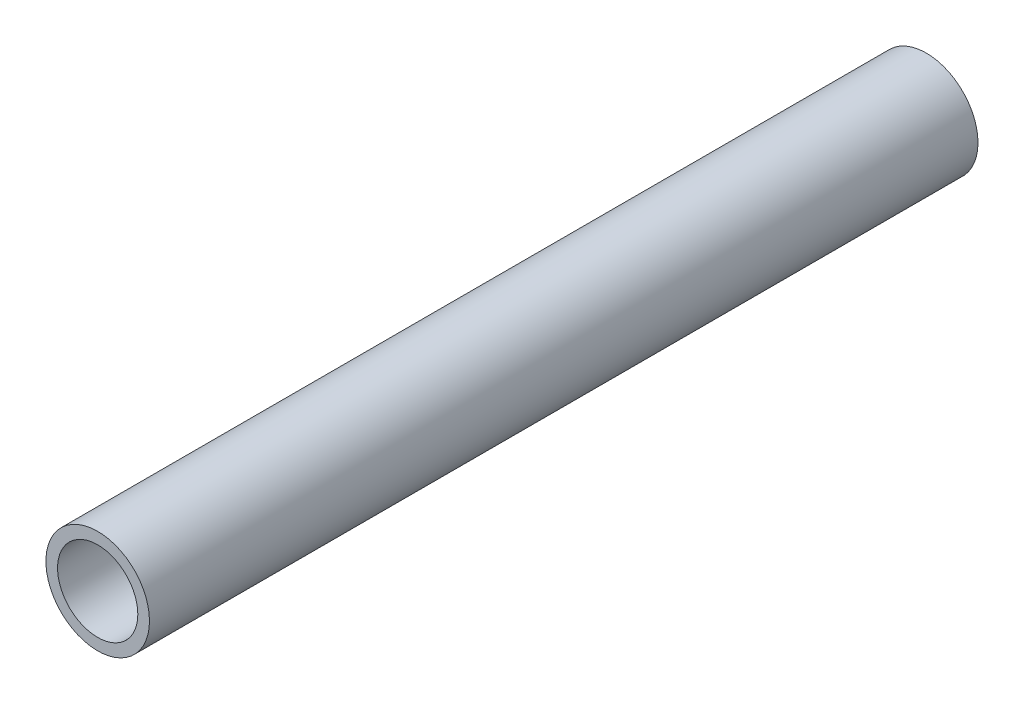
ISO-10303-21;
HEADER;
FILE_DESCRIPTION(('STEP AP214'),'2;1');
FILE_NAME('part.step','',(''),(''),'','','');
FILE_SCHEMA(('AUTOMOTIVE_DESIGN { 1 0 10303 214 1 1 1 1 }'));
ENDSEC;
DATA;
#1=APPLICATION_CONTEXT('core data for automotive mechanical design processes');
#2=APPLICATION_PROTOCOL_DEFINITION('international standard','automotive_design',2000,#1);
#3=PRODUCT_CONTEXT('',#1,'mechanical');
#4=PRODUCT('Part','Part','',(#3));
#5=PRODUCT_RELATED_PRODUCT_CATEGORY('part','',(#4));
#6=PRODUCT_DEFINITION_FORMATION('','',#4);
#7=PRODUCT_DEFINITION_CONTEXT('part definition',#1,'design');
#8=PRODUCT_DEFINITION('design','',#6,#7);
#9=PRODUCT_DEFINITION_SHAPE('','',#8);
#10=(LENGTH_UNIT() NAMED_UNIT(*) SI_UNIT(.MILLI.,.METRE.));
#11=(NAMED_UNIT(*) PLANE_ANGLE_UNIT() SI_UNIT($,.RADIAN.));
#12=(NAMED_UNIT(*) SI_UNIT($,.STERADIAN.) SOLID_ANGLE_UNIT());
#13=UNCERTAINTY_MEASURE_WITH_UNIT(LENGTH_MEASURE(1.E-05),#10,'distance_accuracy_value','');
#14=(GEOMETRIC_REPRESENTATION_CONTEXT(3) GLOBAL_UNCERTAINTY_ASSIGNED_CONTEXT((#13)) GLOBAL_UNIT_ASSIGNED_CONTEXT((#10,
#11,#12)) REPRESENTATION_CONTEXT('',''));
#15=CARTESIAN_POINT('',(0.,0.,0.));
#16=DIRECTION('',(0.,0.,1.));
#17=DIRECTION('',(1.,0.,0.));
#18=AXIS2_PLACEMENT_3D('',#15,#16,#17);
#19=CARTESIAN_POINT('',(0.,0.,16.));
#20=DIRECTION('',(0.,0.,1.));
#21=DIRECTION('',(1.,0.,0.));
#22=AXIS2_PLACEMENT_3D('',#19,#20,#21);
#23=PLANE('',#22);
#24=CARTESIAN_POINT('',(0.,0.,16.));
#25=DIRECTION('',(0.,0.,1.));
#26=DIRECTION('',(1.,0.,0.));
#27=AXIS2_PLACEMENT_3D('',#24,#25,#26);
#28=CIRCLE('',#27,1.);
#29=CARTESIAN_POINT('',(1.,0.,16.));
#30=VERTEX_POINT('',#29);
#31=EDGE_CURVE('E10',#30,#30,#28,.T.);
#32=ORIENTED_EDGE('',*,*,#31,.T.);
#33=EDGE_LOOP('',(#32));
#34=FACE_BOUND('',#33,.T.);
#35=CARTESIAN_POINT('',(0.,0.,16.));
#36=DIRECTION('',(0.,0.,1.));
#37=DIRECTION('',(1.,0.,0.));
#38=AXIS2_PLACEMENT_3D('',#35,#36,#37);
#39=CIRCLE('',#38,0.775);
#40=CARTESIAN_POINT('',(0.775,0.,16.));
#41=VERTEX_POINT('',#40);
#42=EDGE_CURVE('E46',#41,#41,#39,.T.);
#43=ORIENTED_EDGE('',*,*,#42,.F.);
#44=EDGE_LOOP('',(#43));
#45=FACE_BOUND('',#44,.T.);
#46=ADVANCED_FACE('F35',(#34,#45),#23,.T.);
#47=CARTESIAN_POINT('',(0.,0.,0.));
#48=DIRECTION('',(0.,0.,1.));
#49=DIRECTION('',(1.,0.,0.));
#50=AXIS2_PLACEMENT_3D('',#47,#48,#49);
#51=PLANE('',#50);
#52=CARTESIAN_POINT('',(0.,0.,0.));
#53=DIRECTION('',(0.,0.,1.));
#54=DIRECTION('',(1.,0.,0.));
#55=AXIS2_PLACEMENT_3D('',#52,#53,#54);
#56=CIRCLE('',#55,1.);
#57=CARTESIAN_POINT('',(1.,0.,0.));
#58=VERTEX_POINT('',#57);
#59=EDGE_CURVE('E39',#58,#58,#56,.T.);
#60=ORIENTED_EDGE('',*,*,#59,.F.);
#61=EDGE_LOOP('',(#60));
#62=FACE_BOUND('',#61,.T.);
#63=CARTESIAN_POINT('',(0.,0.,0.));
#64=DIRECTION('',(0.,0.,1.));
#65=DIRECTION('',(1.,0.,0.));
#66=AXIS2_PLACEMENT_3D('',#63,#64,#65);
#67=CIRCLE('',#66,0.775);
#68=CARTESIAN_POINT('',(0.775,0.,0.));
#69=VERTEX_POINT('',#68);
#70=EDGE_CURVE('E48',#69,#69,#67,.T.);
#71=ORIENTED_EDGE('',*,*,#70,.T.);
#72=EDGE_LOOP('',(#71));
#73=FACE_BOUND('',#72,.T.);
#74=ADVANCED_FACE('F58',(#62,#73),#51,.F.);
#75=CARTESIAN_POINT('',(0.,0.,16.));
#76=DIRECTION('',(0.,0.,-1.));
#77=DIRECTION('',(-1.,0.,0.));
#78=AXIS2_PLACEMENT_3D('',#75,#76,#77);
#79=CYLINDRICAL_SURFACE('',#78,1.);
#80=ORIENTED_EDGE('',*,*,#31,.F.);
#81=EDGE_LOOP('',(#80));
#82=FACE_BOUND('',#81,.T.);
#83=ORIENTED_EDGE('',*,*,#59,.T.);
#84=EDGE_LOOP('',(#83));
#85=FACE_BOUND('',#84,.T.);
#86=ADVANCED_FACE('F37',(#82,#85),#79,.T.);
#87=CARTESIAN_POINT('',(0.,0.,16.));
#88=DIRECTION('',(0.,0.,-1.));
#89=DIRECTION('',(-1.,0.,0.));
#90=AXIS2_PLACEMENT_3D('',#87,#88,#89);
#91=CYLINDRICAL_SURFACE('',#90,0.775);
#92=ORIENTED_EDGE('',*,*,#42,.T.);
#93=EDGE_LOOP('',(#92));
#94=FACE_BOUND('',#93,.T.);
#95=ORIENTED_EDGE('',*,*,#70,.F.);
#96=EDGE_LOOP('',(#95));
#97=FACE_BOUND('',#96,.T.);
#98=ADVANCED_FACE('F54',(#94,#97),#91,.F.);
#99=CLOSED_SHELL('',(#46,#74,#86,#98));
#100=MANIFOLD_SOLID_BREP('B2',#99);
#101=ADVANCED_BREP_SHAPE_REPRESENTATION('',(#18,#100),#14);
#102=SHAPE_DEFINITION_REPRESENTATION(#9,#101);
ENDSEC;
END-ISO-10303-21;
